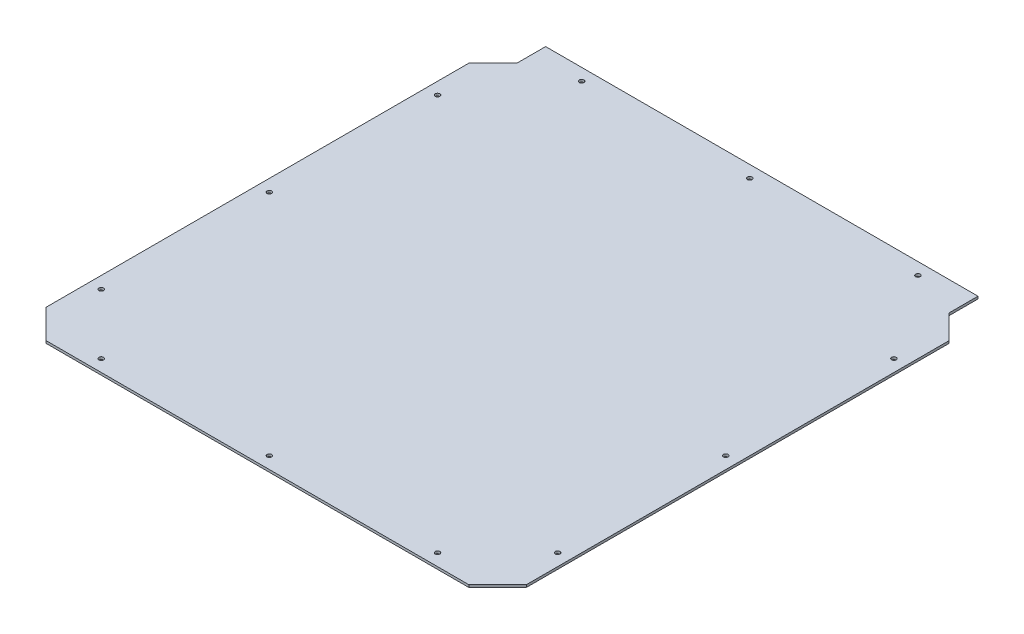
ISO-10303-21;
HEADER;
FILE_DESCRIPTION(('STEP AP214'),'2;1');
FILE_NAME('part.step','',(''),(''),'','','');
FILE_SCHEMA(('AUTOMOTIVE_DESIGN { 1 0 10303 214 1 1 1 1 }'));
ENDSEC;
DATA;
#1=APPLICATION_CONTEXT('core data for automotive mechanical design processes');
#2=APPLICATION_PROTOCOL_DEFINITION('international standard','automotive_design',2000,#1);
#3=PRODUCT_CONTEXT('',#1,'mechanical');
#4=PRODUCT('Part','Part','',(#3));
#5=PRODUCT_RELATED_PRODUCT_CATEGORY('part','',(#4));
#6=PRODUCT_DEFINITION_FORMATION('','',#4);
#7=PRODUCT_DEFINITION_CONTEXT('part definition',#1,'design');
#8=PRODUCT_DEFINITION('design','',#6,#7);
#9=PRODUCT_DEFINITION_SHAPE('','',#8);
#10=(LENGTH_UNIT() NAMED_UNIT(*) SI_UNIT(.MILLI.,.METRE.));
#11=(NAMED_UNIT(*) PLANE_ANGLE_UNIT() SI_UNIT($,.RADIAN.));
#12=(NAMED_UNIT(*) SI_UNIT($,.STERADIAN.) SOLID_ANGLE_UNIT());
#13=UNCERTAINTY_MEASURE_WITH_UNIT(LENGTH_MEASURE(1.E-05),#10,'distance_accuracy_value','');
#14=(GEOMETRIC_REPRESENTATION_CONTEXT(3) GLOBAL_UNCERTAINTY_ASSIGNED_CONTEXT((#13)) GLOBAL_UNIT_ASSIGNED_CONTEXT((#10,
#11,#12)) REPRESENTATION_CONTEXT('',''));
#15=CARTESIAN_POINT('',(0.,0.,0.));
#16=DIRECTION('',(0.,0.,1.));
#17=DIRECTION('',(1.,0.,0.));
#18=AXIS2_PLACEMENT_3D('',#15,#16,#17);
#19=CARTESIAN_POINT('',(-300.,1.5,315.));
#20=DIRECTION('',(1.,0.,0.));
#21=DIRECTION('',(0.,0.,-1.));
#22=AXIS2_PLACEMENT_3D('',#19,#20,#21);
#23=PLANE('',#22);
#24=DIRECTION('',(0.,0.,1.));
#25=VECTOR('',#24,1.);
#26=CARTESIAN_POINT('',(-300.,-1.5,315.));
#27=LINE('',#26,#25);
#28=CARTESIAN_POINT('',(-300.,-1.5,-249.));
#29=VERTEX_POINT('',#28);
#30=CARTESIAN_POINT('',(-300.,-1.5,279.));
#31=VERTEX_POINT('',#30);
#32=EDGE_CURVE('E142',#29,#31,#27,.T.);
#33=ORIENTED_EDGE('',*,*,#32,.T.);
#34=DIRECTION('',(0.,1.,0.));
#35=VECTOR('',#34,1.);
#36=CARTESIAN_POINT('',(-300.,-1.5,279.));
#37=LINE('',#36,#35);
#38=CARTESIAN_POINT('',(-300.,1.5,279.));
#39=VERTEX_POINT('',#38);
#40=EDGE_CURVE('E179',#31,#39,#37,.T.);
#41=ORIENTED_EDGE('',*,*,#40,.T.);
#42=DIRECTION('',(0.,0.,1.));
#43=VECTOR('',#42,1.);
#44=CARTESIAN_POINT('',(-300.,1.5,315.));
#45=LINE('',#44,#43);
#46=CARTESIAN_POINT('',(-300.,1.5,-249.));
#47=VERTEX_POINT('',#46);
#48=EDGE_CURVE('E131',#47,#39,#45,.T.);
#49=ORIENTED_EDGE('',*,*,#48,.F.);
#50=DIRECTION('',(0.,1.,0.));
#51=VECTOR('',#50,1.);
#52=CARTESIAN_POINT('',(-300.,-1.5,-249.));
#53=LINE('',#52,#51);
#54=EDGE_CURVE('E116',#29,#47,#53,.T.);
#55=ORIENTED_EDGE('',*,*,#54,.F.);
#56=EDGE_LOOP('',(#33,#41,#49,#55));
#57=FACE_BOUND('',#56,.T.);
#58=ADVANCED_FACE('F33',(#57),#23,.F.);
#59=CARTESIAN_POINT('',(300.,1.5,315.));
#60=DIRECTION('',(0.,0.,-1.));
#61=DIRECTION('',(-1.,0.,0.));
#62=AXIS2_PLACEMENT_3D('',#59,#60,#61);
#63=PLANE('',#62);
#64=DIRECTION('',(1.,0.,0.));
#65=VECTOR('',#64,1.);
#66=CARTESIAN_POINT('',(300.,-1.5,315.));
#67=LINE('',#66,#65);
#68=CARTESIAN_POINT('',(-264.,-1.5,315.));
#69=VERTEX_POINT('',#68);
#70=CARTESIAN_POINT('',(264.,-1.5,315.));
#71=VERTEX_POINT('',#70);
#72=EDGE_CURVE('E137',#69,#71,#67,.T.);
#73=ORIENTED_EDGE('',*,*,#72,.T.);
#74=DIRECTION('',(0.,1.,0.));
#75=VECTOR('',#74,1.);
#76=CARTESIAN_POINT('',(264.,-1.5,315.));
#77=LINE('',#76,#75);
#78=CARTESIAN_POINT('',(264.,1.5,315.));
#79=VERTEX_POINT('',#78);
#80=EDGE_CURVE('E165',#71,#79,#77,.T.);
#81=ORIENTED_EDGE('',*,*,#80,.T.);
#82=DIRECTION('',(1.,0.,0.));
#83=VECTOR('',#82,1.);
#84=CARTESIAN_POINT('',(300.,1.5,315.));
#85=LINE('',#84,#83);
#86=CARTESIAN_POINT('',(-264.,1.5,315.));
#87=VERTEX_POINT('',#86);
#88=EDGE_CURVE('E134',#87,#79,#85,.T.);
#89=ORIENTED_EDGE('',*,*,#88,.F.);
#90=DIRECTION('',(0.,1.,0.));
#91=VECTOR('',#90,1.);
#92=CARTESIAN_POINT('',(-264.,-1.5,315.));
#93=LINE('',#92,#91);
#94=EDGE_CURVE('E177',#69,#87,#93,.T.);
#95=ORIENTED_EDGE('',*,*,#94,.F.);
#96=EDGE_LOOP('',(#73,#81,#89,#95));
#97=FACE_BOUND('',#96,.T.);
#98=ADVANCED_FACE('F313',(#97),#63,.F.);
#99=CARTESIAN_POINT('',(300.,1.5,315.));
#100=DIRECTION('',(-1.,0.,0.));
#101=DIRECTION('',(0.,0.,1.));
#102=AXIS2_PLACEMENT_3D('',#99,#100,#101);
#103=PLANE('',#102);
#104=DIRECTION('',(0.,0.,-1.));
#105=VECTOR('',#104,1.);
#106=CARTESIAN_POINT('',(300.,1.5,315.));
#107=LINE('',#106,#105);
#108=CARTESIAN_POINT('',(300.,1.5,279.));
#109=VERTEX_POINT('',#108);
#110=CARTESIAN_POINT('',(300.,1.5,-249.));
#111=VERTEX_POINT('',#110);
#112=EDGE_CURVE('E41',#109,#111,#107,.T.);
#113=ORIENTED_EDGE('',*,*,#112,.F.);
#114=DIRECTION('',(0.,1.,0.));
#115=VECTOR('',#114,1.);
#116=CARTESIAN_POINT('',(300.,-1.5,279.));
#117=LINE('',#116,#115);
#118=CARTESIAN_POINT('',(300.,-1.5,279.));
#119=VERTEX_POINT('',#118);
#120=EDGE_CURVE('E168',#119,#109,#117,.T.);
#121=ORIENTED_EDGE('',*,*,#120,.F.);
#122=DIRECTION('',(0.,0.,-1.));
#123=VECTOR('',#122,1.);
#124=CARTESIAN_POINT('',(300.,-1.5,315.));
#125=LINE('',#124,#123);
#126=CARTESIAN_POINT('',(300.,-1.5,-249.));
#127=VERTEX_POINT('',#126);
#128=EDGE_CURVE('E132',#119,#127,#125,.T.);
#129=ORIENTED_EDGE('',*,*,#128,.T.);
#130=DIRECTION('',(0.,1.,0.));
#131=VECTOR('',#130,1.);
#132=CARTESIAN_POINT('',(300.,-1.5,-249.));
#133=LINE('',#132,#131);
#134=EDGE_CURVE('E146',#127,#111,#133,.T.);
#135=ORIENTED_EDGE('',*,*,#134,.T.);
#136=EDGE_LOOP('',(#113,#121,#129,#135));
#137=FACE_BOUND('',#136,.T.);
#138=ADVANCED_FACE('F298',(#137),#103,.F.);
#139=CARTESIAN_POINT('',(300.,1.5,-315.));
#140=DIRECTION('',(0.,0.,1.));
#141=DIRECTION('',(1.,0.,0.));
#142=AXIS2_PLACEMENT_3D('',#139,#140,#141);
#143=PLANE('',#142);
#144=DIRECTION('',(-1.,0.,0.));
#145=VECTOR('',#144,1.);
#146=CARTESIAN_POINT('',(300.,-1.5,-315.));
#147=LINE('',#146,#145);
#148=CARTESIAN_POINT('',(270.,-1.5,-315.));
#149=VERTEX_POINT('',#148);
#150=CARTESIAN_POINT('',(-270.,-1.5,-315.));
#151=VERTEX_POINT('',#150);
#152=EDGE_CURVE('E36',#149,#151,#147,.T.);
#153=ORIENTED_EDGE('',*,*,#152,.T.);
#154=DIRECTION('',(0.,1.,0.));
#155=VECTOR('',#154,1.);
#156=CARTESIAN_POINT('',(-270.,-1.5,-315.));
#157=LINE('',#156,#155);
#158=CARTESIAN_POINT('',(-270.,1.5,-315.));
#159=VERTEX_POINT('',#158);
#160=EDGE_CURVE('E109',#151,#159,#157,.T.);
#161=ORIENTED_EDGE('',*,*,#160,.T.);
#162=DIRECTION('',(-1.,0.,0.));
#163=VECTOR('',#162,1.);
#164=CARTESIAN_POINT('',(300.,1.5,-315.));
#165=LINE('',#164,#163);
#166=CARTESIAN_POINT('',(270.,1.5,-315.));
#167=VERTEX_POINT('',#166);
#168=EDGE_CURVE('E11',#167,#159,#165,.T.);
#169=ORIENTED_EDGE('',*,*,#168,.F.);
#170=DIRECTION('',(0.,1.,0.));
#171=VECTOR('',#170,1.);
#172=CARTESIAN_POINT('',(270.,-1.5,-315.));
#173=LINE('',#172,#171);
#174=EDGE_CURVE('E130',#149,#167,#173,.T.);
#175=ORIENTED_EDGE('',*,*,#174,.F.);
#176=EDGE_LOOP('',(#153,#161,#169,#175));
#177=FACE_BOUND('',#176,.T.);
#178=ADVANCED_FACE('F129',(#177),#143,.F.);
#179=CARTESIAN_POINT('',(0.,1.5,0.));
#180=DIRECTION('',(0.,1.,0.));
#181=DIRECTION('',(0.,0.,1.));
#182=AXIS2_PLACEMENT_3D('',#179,#180,#181);
#183=PLANE('',#182);
#184=CARTESIAN_POINT('',(-210.,1.5,-300.));
#185=DIRECTION('',(0.,1.,0.));
#186=DIRECTION('',(0.,0.,1.));
#187=AXIS2_PLACEMENT_3D('',#184,#185,#186);
#188=CIRCLE('',#187,2.89999999999999);
#189=CARTESIAN_POINT('',(-210.,1.5,-297.1));
#190=VERTEX_POINT('',#189);
#191=EDGE_CURVE('E260',#190,#190,#188,.T.);
#192=ORIENTED_EDGE('',*,*,#191,.F.);
#193=EDGE_LOOP('',(#192));
#194=FACE_BOUND('',#193,.T.);
#195=CARTESIAN_POINT('',(0.,1.5,-300.));
#196=DIRECTION('',(0.,1.,0.));
#197=DIRECTION('',(0.,0.,1.));
#198=AXIS2_PLACEMENT_3D('',#195,#196,#197);
#199=CIRCLE('',#198,2.89999999999999);
#200=CARTESIAN_POINT('',(0.,1.5,-297.1));
#201=VERTEX_POINT('',#200);
#202=EDGE_CURVE('E254',#201,#201,#199,.T.);
#203=ORIENTED_EDGE('',*,*,#202,.F.);
#204=EDGE_LOOP('',(#203));
#205=FACE_BOUND('',#204,.T.);
#206=CARTESIAN_POINT('',(210.,1.5,-300.));
#207=DIRECTION('',(0.,1.,0.));
#208=DIRECTION('',(0.,0.,1.));
#209=AXIS2_PLACEMENT_3D('',#206,#207,#208);
#210=CIRCLE('',#209,2.89999999999999);
#211=CARTESIAN_POINT('',(210.,1.5,-297.1));
#212=VERTEX_POINT('',#211);
#213=EDGE_CURVE('E248',#212,#212,#210,.T.);
#214=ORIENTED_EDGE('',*,*,#213,.F.);
#215=EDGE_LOOP('',(#214));
#216=FACE_BOUND('',#215,.T.);
#217=CARTESIAN_POINT('',(285.,1.5,-195.));
#218=DIRECTION('',(0.,1.,0.));
#219=DIRECTION('',(0.,0.,1.));
#220=AXIS2_PLACEMENT_3D('',#217,#218,#219);
#221=CIRCLE('',#220,2.90000000000001);
#222=CARTESIAN_POINT('',(285.,1.5,-192.1));
#223=VERTEX_POINT('',#222);
#224=EDGE_CURVE('E242',#223,#223,#221,.T.);
#225=ORIENTED_EDGE('',*,*,#224,.F.);
#226=EDGE_LOOP('',(#225));
#227=FACE_BOUND('',#226,.T.);
#228=CARTESIAN_POINT('',(285.,1.5,15.));
#229=DIRECTION('',(0.,1.,0.));
#230=DIRECTION('',(0.,0.,1.));
#231=AXIS2_PLACEMENT_3D('',#228,#229,#230);
#232=CIRCLE('',#231,2.90000000000001);
#233=CARTESIAN_POINT('',(285.,1.5,17.9));
#234=VERTEX_POINT('',#233);
#235=EDGE_CURVE('E236',#234,#234,#232,.T.);
#236=ORIENTED_EDGE('',*,*,#235,.F.);
#237=EDGE_LOOP('',(#236));
#238=FACE_BOUND('',#237,.T.);
#239=CARTESIAN_POINT('',(285.,1.5,225.));
#240=DIRECTION('',(0.,1.,0.));
#241=DIRECTION('',(0.,0.,1.));
#242=AXIS2_PLACEMENT_3D('',#239,#240,#241);
#243=CIRCLE('',#242,2.90000000000001);
#244=CARTESIAN_POINT('',(285.,1.5,227.9));
#245=VERTEX_POINT('',#244);
#246=EDGE_CURVE('E230',#245,#245,#243,.T.);
#247=ORIENTED_EDGE('',*,*,#246,.F.);
#248=EDGE_LOOP('',(#247));
#249=FACE_BOUND('',#248,.T.);
#250=CARTESIAN_POINT('',(210.,1.5,300.));
#251=DIRECTION('',(0.,1.,0.));
#252=DIRECTION('',(0.,0.,1.));
#253=AXIS2_PLACEMENT_3D('',#250,#251,#252);
#254=CIRCLE('',#253,2.89999999999999);
#255=CARTESIAN_POINT('',(210.,1.5,302.9));
#256=VERTEX_POINT('',#255);
#257=EDGE_CURVE('E224',#256,#256,#254,.T.);
#258=ORIENTED_EDGE('',*,*,#257,.F.);
#259=EDGE_LOOP('',(#258));
#260=FACE_BOUND('',#259,.T.);
#261=CARTESIAN_POINT('',(0.,1.5,300.));
#262=DIRECTION('',(0.,1.,0.));
#263=DIRECTION('',(0.,0.,1.));
#264=AXIS2_PLACEMENT_3D('',#261,#262,#263);
#265=CIRCLE('',#264,2.89999999999999);
#266=CARTESIAN_POINT('',(0.,1.5,302.9));
#267=VERTEX_POINT('',#266);
#268=EDGE_CURVE('E218',#267,#267,#265,.T.);
#269=ORIENTED_EDGE('',*,*,#268,.F.);
#270=EDGE_LOOP('',(#269));
#271=FACE_BOUND('',#270,.T.);
#272=CARTESIAN_POINT('',(-210.,1.5,300.));
#273=DIRECTION('',(0.,1.,0.));
#274=DIRECTION('',(0.,0.,1.));
#275=AXIS2_PLACEMENT_3D('',#272,#273,#274);
#276=CIRCLE('',#275,2.89999999999999);
#277=CARTESIAN_POINT('',(-210.,1.5,302.9));
#278=VERTEX_POINT('',#277);
#279=EDGE_CURVE('E212',#278,#278,#276,.T.);
#280=ORIENTED_EDGE('',*,*,#279,.F.);
#281=EDGE_LOOP('',(#280));
#282=FACE_BOUND('',#281,.T.);
#283=CARTESIAN_POINT('',(-285.,1.5,225.));
#284=DIRECTION('',(0.,1.,0.));
#285=DIRECTION('',(0.,0.,1.));
#286=AXIS2_PLACEMENT_3D('',#283,#284,#285);
#287=CIRCLE('',#286,2.90000000000001);
#288=CARTESIAN_POINT('',(-285.,1.5,227.9));
#289=VERTEX_POINT('',#288);
#290=EDGE_CURVE('E206',#289,#289,#287,.T.);
#291=ORIENTED_EDGE('',*,*,#290,.F.);
#292=EDGE_LOOP('',(#291));
#293=FACE_BOUND('',#292,.T.);
#294=CARTESIAN_POINT('',(-285.,1.5,15.0000000000001));
#295=DIRECTION('',(0.,1.,0.));
#296=DIRECTION('',(0.,0.,1.));
#297=AXIS2_PLACEMENT_3D('',#294,#295,#296);
#298=CIRCLE('',#297,2.90000000000001);
#299=CARTESIAN_POINT('',(-285.,1.5,17.9000000000001));
#300=VERTEX_POINT('',#299);
#301=EDGE_CURVE('E200',#300,#300,#298,.T.);
#302=ORIENTED_EDGE('',*,*,#301,.F.);
#303=EDGE_LOOP('',(#302));
#304=FACE_BOUND('',#303,.T.);
#305=CARTESIAN_POINT('',(-285.,1.5,-195.));
#306=DIRECTION('',(0.,1.,0.));
#307=DIRECTION('',(0.,0.,1.));
#308=AXIS2_PLACEMENT_3D('',#305,#306,#307);
#309=CIRCLE('',#308,2.90000000000001);
#310=CARTESIAN_POINT('',(-285.,1.5,-192.1));
#311=VERTEX_POINT('',#310);
#312=EDGE_CURVE('E194',#311,#311,#309,.T.);
#313=ORIENTED_EDGE('',*,*,#312,.F.);
#314=EDGE_LOOP('',(#313));
#315=FACE_BOUND('',#314,.T.);
#316=DIRECTION('',(-0.707106781186546,0.,0.707106781186549));
#317=VECTOR('',#316,1.);
#318=CARTESIAN_POINT('',(300.,1.5,279.));
#319=LINE('',#318,#317);
#320=EDGE_CURVE('E172',#109,#79,#319,.T.);
#321=ORIENTED_EDGE('',*,*,#320,.F.);
#322=ORIENTED_EDGE('',*,*,#112,.T.);
#323=DIRECTION('',(0.70710678118655,0.,0.707106781186545));
#324=VECTOR('',#323,1.);
#325=CARTESIAN_POINT('',(270.,1.5,-279.));
#326=LINE('',#325,#324);
#327=CARTESIAN_POINT('',(270.,1.5,-279.));
#328=VERTEX_POINT('',#327);
#329=EDGE_CURVE('E156',#328,#111,#326,.T.);
#330=ORIENTED_EDGE('',*,*,#329,.F.);
#331=DIRECTION('',(0.,0.,1.));
#332=VECTOR('',#331,1.);
#333=CARTESIAN_POINT('',(270.,1.5,-315.));
#334=LINE('',#333,#332);
#335=EDGE_CURVE('E159',#167,#328,#334,.T.);
#336=ORIENTED_EDGE('',*,*,#335,.F.);
#337=ORIENTED_EDGE('',*,*,#168,.T.);
#338=DIRECTION('',(0.,0.,-1.));
#339=VECTOR('',#338,1.);
#340=CARTESIAN_POINT('',(-270.,1.5,-278.999999999999));
#341=LINE('',#340,#339);
#342=CARTESIAN_POINT('',(-270.,1.5,-278.999999999999));
#343=VERTEX_POINT('',#342);
#344=EDGE_CURVE('E112',#343,#159,#341,.T.);
#345=ORIENTED_EDGE('',*,*,#344,.F.);
#346=DIRECTION('',(0.707106781186554,0.,-0.707106781186541));
#347=VECTOR('',#346,1.);
#348=CARTESIAN_POINT('',(-300.,1.5,-249.));
#349=LINE('',#348,#347);
#350=EDGE_CURVE('E126',#47,#343,#349,.T.);
#351=ORIENTED_EDGE('',*,*,#350,.F.);
#352=ORIENTED_EDGE('',*,*,#48,.T.);
#353=DIRECTION('',(-0.707106781186548,0.,-0.707106781186548));
#354=VECTOR('',#353,1.);
#355=CARTESIAN_POINT('',(-300.,1.5,279.));
#356=LINE('',#355,#354);
#357=EDGE_CURVE('E171',#87,#39,#356,.T.);
#358=ORIENTED_EDGE('',*,*,#357,.F.);
#359=ORIENTED_EDGE('',*,*,#88,.T.);
#360=EDGE_LOOP('',(#321,#322,#330,#336,#337,#345,#351,#352,#358,#359));
#361=FACE_BOUND('',#360,.T.);
#362=ADVANCED_FACE('F266',(#194,#205,#216,#227,#238,#249,#260,#271,#282,#293,#304,#315,#361),
#183,.T.);
#363=CARTESIAN_POINT('',(0.,-1.5,0.));
#364=DIRECTION('',(0.,1.,0.));
#365=DIRECTION('',(0.,0.,1.));
#366=AXIS2_PLACEMENT_3D('',#363,#364,#365);
#367=PLANE('',#366);
#368=CARTESIAN_POINT('',(-210.,-1.5,-300.));
#369=DIRECTION('',(0.,1.,0.));
#370=DIRECTION('',(0.,0.,1.));
#371=AXIS2_PLACEMENT_3D('',#368,#369,#370);
#372=CIRCLE('',#371,2.89999999999999);
#373=CARTESIAN_POINT('',(-210.,-1.5,-297.1));
#374=VERTEX_POINT('',#373);
#375=EDGE_CURVE('E257',#374,#374,#372,.T.);
#376=ORIENTED_EDGE('',*,*,#375,.T.);
#377=EDGE_LOOP('',(#376));
#378=FACE_BOUND('',#377,.T.);
#379=CARTESIAN_POINT('',(0.,-1.5,-300.));
#380=DIRECTION('',(0.,1.,0.));
#381=DIRECTION('',(0.,0.,1.));
#382=AXIS2_PLACEMENT_3D('',#379,#380,#381);
#383=CIRCLE('',#382,2.9);
#384=CARTESIAN_POINT('',(0.,-1.5,-297.1));
#385=VERTEX_POINT('',#384);
#386=EDGE_CURVE('E251',#385,#385,#383,.T.);
#387=ORIENTED_EDGE('',*,*,#386,.T.);
#388=EDGE_LOOP('',(#387));
#389=FACE_BOUND('',#388,.T.);
#390=CARTESIAN_POINT('',(210.,-1.5,-300.));
#391=DIRECTION('',(0.,1.,0.));
#392=DIRECTION('',(0.,0.,1.));
#393=AXIS2_PLACEMENT_3D('',#390,#391,#392);
#394=CIRCLE('',#393,2.89999999999999);
#395=CARTESIAN_POINT('',(210.,-1.5,-297.1));
#396=VERTEX_POINT('',#395);
#397=EDGE_CURVE('E245',#396,#396,#394,.T.);
#398=ORIENTED_EDGE('',*,*,#397,.T.);
#399=EDGE_LOOP('',(#398));
#400=FACE_BOUND('',#399,.T.);
#401=CARTESIAN_POINT('',(285.,-1.5,-195.));
#402=DIRECTION('',(0.,1.,0.));
#403=DIRECTION('',(0.,0.,1.));
#404=AXIS2_PLACEMENT_3D('',#401,#402,#403);
#405=CIRCLE('',#404,2.90000000000001);
#406=CARTESIAN_POINT('',(285.,-1.5,-192.1));
#407=VERTEX_POINT('',#406);
#408=EDGE_CURVE('E239',#407,#407,#405,.T.);
#409=ORIENTED_EDGE('',*,*,#408,.T.);
#410=EDGE_LOOP('',(#409));
#411=FACE_BOUND('',#410,.T.);
#412=CARTESIAN_POINT('',(285.,-1.5,15.));
#413=DIRECTION('',(0.,1.,0.));
#414=DIRECTION('',(0.,0.,1.));
#415=AXIS2_PLACEMENT_3D('',#412,#413,#414);
#416=CIRCLE('',#415,2.90000000000001);
#417=CARTESIAN_POINT('',(285.,-1.5,17.9));
#418=VERTEX_POINT('',#417);
#419=EDGE_CURVE('E233',#418,#418,#416,.T.);
#420=ORIENTED_EDGE('',*,*,#419,.T.);
#421=EDGE_LOOP('',(#420));
#422=FACE_BOUND('',#421,.T.);
#423=CARTESIAN_POINT('',(285.,-1.5,225.));
#424=DIRECTION('',(0.,1.,0.));
#425=DIRECTION('',(0.,0.,1.));
#426=AXIS2_PLACEMENT_3D('',#423,#424,#425);
#427=CIRCLE('',#426,2.90000000000001);
#428=CARTESIAN_POINT('',(285.,-1.5,227.9));
#429=VERTEX_POINT('',#428);
#430=EDGE_CURVE('E227',#429,#429,#427,.T.);
#431=ORIENTED_EDGE('',*,*,#430,.T.);
#432=EDGE_LOOP('',(#431));
#433=FACE_BOUND('',#432,.T.);
#434=CARTESIAN_POINT('',(210.,-1.5,300.));
#435=DIRECTION('',(0.,1.,0.));
#436=DIRECTION('',(0.,0.,1.));
#437=AXIS2_PLACEMENT_3D('',#434,#435,#436);
#438=CIRCLE('',#437,2.89999999999999);
#439=CARTESIAN_POINT('',(210.,-1.5,302.9));
#440=VERTEX_POINT('',#439);
#441=EDGE_CURVE('E221',#440,#440,#438,.T.);
#442=ORIENTED_EDGE('',*,*,#441,.T.);
#443=EDGE_LOOP('',(#442));
#444=FACE_BOUND('',#443,.T.);
#445=CARTESIAN_POINT('',(0.,-1.5,300.));
#446=DIRECTION('',(0.,1.,0.));
#447=DIRECTION('',(0.,0.,1.));
#448=AXIS2_PLACEMENT_3D('',#445,#446,#447);
#449=CIRCLE('',#448,2.9);
#450=CARTESIAN_POINT('',(0.,-1.5,302.9));
#451=VERTEX_POINT('',#450);
#452=EDGE_CURVE('E215',#451,#451,#449,.T.);
#453=ORIENTED_EDGE('',*,*,#452,.T.);
#454=EDGE_LOOP('',(#453));
#455=FACE_BOUND('',#454,.T.);
#456=CARTESIAN_POINT('',(-210.,-1.5,300.));
#457=DIRECTION('',(0.,1.,0.));
#458=DIRECTION('',(0.,0.,1.));
#459=AXIS2_PLACEMENT_3D('',#456,#457,#458);
#460=CIRCLE('',#459,2.89999999999999);
#461=CARTESIAN_POINT('',(-210.,-1.5,302.9));
#462=VERTEX_POINT('',#461);
#463=EDGE_CURVE('E209',#462,#462,#460,.T.);
#464=ORIENTED_EDGE('',*,*,#463,.T.);
#465=EDGE_LOOP('',(#464));
#466=FACE_BOUND('',#465,.T.);
#467=CARTESIAN_POINT('',(-285.,-1.5,225.));
#468=DIRECTION('',(0.,1.,0.));
#469=DIRECTION('',(0.,0.,1.));
#470=AXIS2_PLACEMENT_3D('',#467,#468,#469);
#471=CIRCLE('',#470,2.90000000000001);
#472=CARTESIAN_POINT('',(-285.,-1.5,227.9));
#473=VERTEX_POINT('',#472);
#474=EDGE_CURVE('E203',#473,#473,#471,.T.);
#475=ORIENTED_EDGE('',*,*,#474,.T.);
#476=EDGE_LOOP('',(#475));
#477=FACE_BOUND('',#476,.T.);
#478=CARTESIAN_POINT('',(-285.,-1.5,15.0000000000001));
#479=DIRECTION('',(0.,1.,0.));
#480=DIRECTION('',(0.,0.,1.));
#481=AXIS2_PLACEMENT_3D('',#478,#479,#480);
#482=CIRCLE('',#481,2.90000000000001);
#483=CARTESIAN_POINT('',(-285.,-1.5,17.9000000000001));
#484=VERTEX_POINT('',#483);
#485=EDGE_CURVE('E197',#484,#484,#482,.T.);
#486=ORIENTED_EDGE('',*,*,#485,.T.);
#487=EDGE_LOOP('',(#486));
#488=FACE_BOUND('',#487,.T.);
#489=CARTESIAN_POINT('',(-285.,-1.5,-195.));
#490=DIRECTION('',(0.,1.,0.));
#491=DIRECTION('',(0.,0.,1.));
#492=AXIS2_PLACEMENT_3D('',#489,#490,#491);
#493=CIRCLE('',#492,2.90000000000001);
#494=CARTESIAN_POINT('',(-285.,-1.5,-192.1));
#495=VERTEX_POINT('',#494);
#496=EDGE_CURVE('E174',#495,#495,#493,.T.);
#497=ORIENTED_EDGE('',*,*,#496,.T.);
#498=EDGE_LOOP('',(#497));
#499=FACE_BOUND('',#498,.T.);
#500=ORIENTED_EDGE('',*,*,#128,.F.);
#501=DIRECTION('',(-0.707106781186546,0.,0.707106781186549));
#502=VECTOR('',#501,1.);
#503=CARTESIAN_POINT('',(300.,-1.5,279.));
#504=LINE('',#503,#502);
#505=EDGE_CURVE('E169',#119,#71,#504,.T.);
#506=ORIENTED_EDGE('',*,*,#505,.T.);
#507=ORIENTED_EDGE('',*,*,#72,.F.);
#508=DIRECTION('',(-0.707106781186548,0.,-0.707106781186548));
#509=VECTOR('',#508,1.);
#510=CARTESIAN_POINT('',(-300.,-1.5,279.));
#511=LINE('',#510,#509);
#512=EDGE_CURVE('E180',#69,#31,#511,.T.);
#513=ORIENTED_EDGE('',*,*,#512,.T.);
#514=ORIENTED_EDGE('',*,*,#32,.F.);
#515=DIRECTION('',(0.707106781186554,0.,-0.707106781186541));
#516=VECTOR('',#515,1.);
#517=CARTESIAN_POINT('',(-300.,-1.5,-249.));
#518=LINE('',#517,#516);
#519=CARTESIAN_POINT('',(-270.,-1.5,-278.999999999999));
#520=VERTEX_POINT('',#519);
#521=EDGE_CURVE('E117',#29,#520,#518,.T.);
#522=ORIENTED_EDGE('',*,*,#521,.T.);
#523=DIRECTION('',(0.,0.,-1.));
#524=VECTOR('',#523,1.);
#525=CARTESIAN_POINT('',(-270.,-1.5,-278.999999999999));
#526=LINE('',#525,#524);
#527=EDGE_CURVE('E49',#520,#151,#526,.T.);
#528=ORIENTED_EDGE('',*,*,#527,.T.);
#529=ORIENTED_EDGE('',*,*,#152,.F.);
#530=DIRECTION('',(0.,0.,1.));
#531=VECTOR('',#530,1.);
#532=CARTESIAN_POINT('',(270.,-1.5,-315.));
#533=LINE('',#532,#531);
#534=CARTESIAN_POINT('',(270.,-1.5,-279.));
#535=VERTEX_POINT('',#534);
#536=EDGE_CURVE('E158',#149,#535,#533,.T.);
#537=ORIENTED_EDGE('',*,*,#536,.T.);
#538=DIRECTION('',(0.70710678118655,0.,0.707106781186545));
#539=VECTOR('',#538,1.);
#540=CARTESIAN_POINT('',(270.,-1.5,-279.));
#541=LINE('',#540,#539);
#542=EDGE_CURVE('E57',#535,#127,#541,.T.);
#543=ORIENTED_EDGE('',*,*,#542,.T.);
#544=EDGE_LOOP('',(#500,#506,#507,#513,#514,#522,#528,#529,#537,#543));
#545=FACE_BOUND('',#544,.T.);
#546=ADVANCED_FACE('F123',(#378,#389,#400,#411,#422,#433,#444,#455,#466,#477,#488,#499,#545),
#367,.F.);
#547=CARTESIAN_POINT('',(270.,-1.5,-279.));
#548=DIRECTION('',(-0.707106781186545,0.,0.70710678118655));
#549=DIRECTION('',(0.70710678118655,0.,0.707106781186545));
#550=AXIS2_PLACEMENT_3D('',#547,#548,#549);
#551=PLANE('',#550);
#552=ORIENTED_EDGE('',*,*,#329,.T.);
#553=ORIENTED_EDGE('',*,*,#134,.F.);
#554=ORIENTED_EDGE('',*,*,#542,.F.);
#555=DIRECTION('',(0.,1.,0.));
#556=VECTOR('',#555,1.);
#557=CARTESIAN_POINT('',(270.,-1.5,-279.));
#558=LINE('',#557,#556);
#559=EDGE_CURVE('E153',#535,#328,#558,.T.);
#560=ORIENTED_EDGE('',*,*,#559,.T.);
#561=EDGE_LOOP('',(#552,#553,#554,#560));
#562=FACE_BOUND('',#561,.T.);
#563=ADVANCED_FACE('F299',(#562),#551,.F.);
#564=CARTESIAN_POINT('',(270.,-1.5,-315.));
#565=DIRECTION('',(-1.,0.,0.));
#566=DIRECTION('',(0.,0.,1.));
#567=AXIS2_PLACEMENT_3D('',#564,#565,#566);
#568=PLANE('',#567);
#569=ORIENTED_EDGE('',*,*,#335,.T.);
#570=ORIENTED_EDGE('',*,*,#559,.F.);
#571=ORIENTED_EDGE('',*,*,#536,.F.);
#572=ORIENTED_EDGE('',*,*,#174,.T.);
#573=EDGE_LOOP('',(#569,#570,#571,#572));
#574=FACE_BOUND('',#573,.T.);
#575=ADVANCED_FACE('F301',(#574),#568,.F.);
#576=CARTESIAN_POINT('',(-270.,-1.5,-278.999999999999));
#577=DIRECTION('',(1.,0.,0.));
#578=DIRECTION('',(0.,0.,-1.));
#579=AXIS2_PLACEMENT_3D('',#576,#577,#578);
#580=PLANE('',#579);
#581=ORIENTED_EDGE('',*,*,#344,.T.);
#582=ORIENTED_EDGE('',*,*,#160,.F.);
#583=ORIENTED_EDGE('',*,*,#527,.F.);
#584=DIRECTION('',(0.,1.,0.));
#585=VECTOR('',#584,1.);
#586=CARTESIAN_POINT('',(-270.,-1.5,-278.999999999999));
#587=LINE('',#586,#585);
#588=EDGE_CURVE('E162',#520,#343,#587,.T.);
#589=ORIENTED_EDGE('',*,*,#588,.T.);
#590=EDGE_LOOP('',(#581,#582,#583,#589));
#591=FACE_BOUND('',#590,.T.);
#592=ADVANCED_FACE('F110',(#591),#580,.F.);
#593=CARTESIAN_POINT('',(-300.,-1.5,-249.));
#594=DIRECTION('',(0.707106781186541,0.,0.707106781186554));
#595=DIRECTION('',(0.707106781186554,0.,-0.707106781186541));
#596=AXIS2_PLACEMENT_3D('',#593,#594,#595);
#597=PLANE('',#596);
#598=ORIENTED_EDGE('',*,*,#350,.T.);
#599=ORIENTED_EDGE('',*,*,#588,.F.);
#600=ORIENTED_EDGE('',*,*,#521,.F.);
#601=ORIENTED_EDGE('',*,*,#54,.T.);
#602=EDGE_LOOP('',(#598,#599,#600,#601));
#603=FACE_BOUND('',#602,.T.);
#604=ADVANCED_FACE('F325',(#603),#597,.F.);
#605=CARTESIAN_POINT('',(-300.,-1.5,279.));
#606=DIRECTION('',(0.707106781186547,0.,-0.707106781186547));
#607=DIRECTION('',(-0.707106781186548,0.,-0.707106781186548));
#608=AXIS2_PLACEMENT_3D('',#605,#606,#607);
#609=PLANE('',#608);
#610=ORIENTED_EDGE('',*,*,#357,.T.);
#611=ORIENTED_EDGE('',*,*,#40,.F.);
#612=ORIENTED_EDGE('',*,*,#512,.F.);
#613=ORIENTED_EDGE('',*,*,#94,.T.);
#614=EDGE_LOOP('',(#610,#611,#612,#613));
#615=FACE_BOUND('',#614,.T.);
#616=ADVANCED_FACE('F309',(#615),#609,.F.);
#617=CARTESIAN_POINT('',(300.,-1.5,279.));
#618=DIRECTION('',(-0.707106781186548,0.,-0.707106781186546));
#619=DIRECTION('',(-0.707106781186546,0.,0.707106781186549));
#620=AXIS2_PLACEMENT_3D('',#617,#618,#619);
#621=PLANE('',#620);
#622=ORIENTED_EDGE('',*,*,#320,.T.);
#623=ORIENTED_EDGE('',*,*,#80,.F.);
#624=ORIENTED_EDGE('',*,*,#505,.F.);
#625=ORIENTED_EDGE('',*,*,#120,.T.);
#626=EDGE_LOOP('',(#622,#623,#624,#625));
#627=FACE_BOUND('',#626,.T.);
#628=ADVANCED_FACE('F314',(#627),#621,.F.);
#629=CARTESIAN_POINT('',(-285.,1.5,-195.));
#630=DIRECTION('',(0.,1.,0.));
#631=DIRECTION('',(0.,0.,1.));
#632=AXIS2_PLACEMENT_3D('',#629,#630,#631);
#633=CYLINDRICAL_SURFACE('',#632,2.90000000000001);
#634=ORIENTED_EDGE('',*,*,#496,.F.);
#635=EDGE_LOOP('',(#634));
#636=FACE_BOUND('',#635,.T.);
#637=ORIENTED_EDGE('',*,*,#312,.T.);
#638=EDGE_LOOP('',(#637));
#639=FACE_BOUND('',#638,.T.);
#640=ADVANCED_FACE('F316',(#636,#639),#633,.F.);
#641=CARTESIAN_POINT('',(-285.,1.5,15.0000000000001));
#642=DIRECTION('',(0.,1.,0.));
#643=DIRECTION('',(0.,0.,1.));
#644=AXIS2_PLACEMENT_3D('',#641,#642,#643);
#645=CYLINDRICAL_SURFACE('',#644,2.90000000000001);
#646=ORIENTED_EDGE('',*,*,#485,.F.);
#647=EDGE_LOOP('',(#646));
#648=FACE_BOUND('',#647,.T.);
#649=ORIENTED_EDGE('',*,*,#301,.T.);
#650=EDGE_LOOP('',(#649));
#651=FACE_BOUND('',#650,.T.);
#652=ADVANCED_FACE('F322',(#648,#651),#645,.F.);
#653=CARTESIAN_POINT('',(-285.,1.5,225.));
#654=DIRECTION('',(0.,1.,0.));
#655=DIRECTION('',(0.,0.,1.));
#656=AXIS2_PLACEMENT_3D('',#653,#654,#655);
#657=CYLINDRICAL_SURFACE('',#656,2.90000000000001);
#658=ORIENTED_EDGE('',*,*,#474,.F.);
#659=EDGE_LOOP('',(#658));
#660=FACE_BOUND('',#659,.T.);
#661=ORIENTED_EDGE('',*,*,#290,.T.);
#662=EDGE_LOOP('',(#661));
#663=FACE_BOUND('',#662,.T.);
#664=ADVANCED_FACE('F399',(#660,#663),#657,.F.);
#665=CARTESIAN_POINT('',(-210.,1.5,300.));
#666=DIRECTION('',(0.,1.,0.));
#667=DIRECTION('',(0.,0.,1.));
#668=AXIS2_PLACEMENT_3D('',#665,#666,#667);
#669=CYLINDRICAL_SURFACE('',#668,2.89999999999999);
#670=ORIENTED_EDGE('',*,*,#463,.F.);
#671=EDGE_LOOP('',(#670));
#672=FACE_BOUND('',#671,.T.);
#673=ORIENTED_EDGE('',*,*,#279,.T.);
#674=EDGE_LOOP('',(#673));
#675=FACE_BOUND('',#674,.T.);
#676=ADVANCED_FACE('F409',(#672,#675),#669,.F.);
#677=CARTESIAN_POINT('',(0.,1.5,300.));
#678=DIRECTION('',(0.,1.,0.));
#679=DIRECTION('',(0.,0.,1.));
#680=AXIS2_PLACEMENT_3D('',#677,#678,#679);
#681=CYLINDRICAL_SURFACE('',#680,2.89999999999999);
#682=ORIENTED_EDGE('',*,*,#452,.F.);
#683=EDGE_LOOP('',(#682));
#684=FACE_BOUND('',#683,.T.);
#685=ORIENTED_EDGE('',*,*,#268,.T.);
#686=EDGE_LOOP('',(#685));
#687=FACE_BOUND('',#686,.T.);
#688=ADVANCED_FACE('F419',(#684,#687),#681,.F.);
#689=CARTESIAN_POINT('',(210.,1.5,300.));
#690=DIRECTION('',(0.,1.,0.));
#691=DIRECTION('',(0.,0.,1.));
#692=AXIS2_PLACEMENT_3D('',#689,#690,#691);
#693=CYLINDRICAL_SURFACE('',#692,2.89999999999999);
#694=ORIENTED_EDGE('',*,*,#441,.F.);
#695=EDGE_LOOP('',(#694));
#696=FACE_BOUND('',#695,.T.);
#697=ORIENTED_EDGE('',*,*,#257,.T.);
#698=EDGE_LOOP('',(#697));
#699=FACE_BOUND('',#698,.T.);
#700=ADVANCED_FACE('F429',(#696,#699),#693,.F.);
#701=CARTESIAN_POINT('',(285.,1.5,225.));
#702=DIRECTION('',(0.,1.,0.));
#703=DIRECTION('',(0.,0.,1.));
#704=AXIS2_PLACEMENT_3D('',#701,#702,#703);
#705=CYLINDRICAL_SURFACE('',#704,2.90000000000001);
#706=ORIENTED_EDGE('',*,*,#430,.F.);
#707=EDGE_LOOP('',(#706));
#708=FACE_BOUND('',#707,.T.);
#709=ORIENTED_EDGE('',*,*,#246,.T.);
#710=EDGE_LOOP('',(#709));
#711=FACE_BOUND('',#710,.T.);
#712=ADVANCED_FACE('F439',(#708,#711),#705,.F.);
#713=CARTESIAN_POINT('',(285.,1.5,15.));
#714=DIRECTION('',(0.,1.,0.));
#715=DIRECTION('',(0.,0.,1.));
#716=AXIS2_PLACEMENT_3D('',#713,#714,#715);
#717=CYLINDRICAL_SURFACE('',#716,2.90000000000001);
#718=ORIENTED_EDGE('',*,*,#419,.F.);
#719=EDGE_LOOP('',(#718));
#720=FACE_BOUND('',#719,.T.);
#721=ORIENTED_EDGE('',*,*,#235,.T.);
#722=EDGE_LOOP('',(#721));
#723=FACE_BOUND('',#722,.T.);
#724=ADVANCED_FACE('F449',(#720,#723),#717,.F.);
#725=CARTESIAN_POINT('',(285.,1.5,-195.));
#726=DIRECTION('',(0.,1.,0.));
#727=DIRECTION('',(0.,0.,1.));
#728=AXIS2_PLACEMENT_3D('',#725,#726,#727);
#729=CYLINDRICAL_SURFACE('',#728,2.90000000000001);
#730=ORIENTED_EDGE('',*,*,#408,.F.);
#731=EDGE_LOOP('',(#730));
#732=FACE_BOUND('',#731,.T.);
#733=ORIENTED_EDGE('',*,*,#224,.T.);
#734=EDGE_LOOP('',(#733));
#735=FACE_BOUND('',#734,.T.);
#736=ADVANCED_FACE('F459',(#732,#735),#729,.F.);
#737=CARTESIAN_POINT('',(210.,1.5,-300.));
#738=DIRECTION('',(0.,1.,0.));
#739=DIRECTION('',(0.,0.,1.));
#740=AXIS2_PLACEMENT_3D('',#737,#738,#739);
#741=CYLINDRICAL_SURFACE('',#740,2.89999999999999);
#742=ORIENTED_EDGE('',*,*,#397,.F.);
#743=EDGE_LOOP('',(#742));
#744=FACE_BOUND('',#743,.T.);
#745=ORIENTED_EDGE('',*,*,#213,.T.);
#746=EDGE_LOOP('',(#745));
#747=FACE_BOUND('',#746,.T.);
#748=ADVANCED_FACE('F469',(#744,#747),#741,.F.);
#749=CARTESIAN_POINT('',(0.,1.5,-300.));
#750=DIRECTION('',(0.,1.,0.));
#751=DIRECTION('',(0.,0.,1.));
#752=AXIS2_PLACEMENT_3D('',#749,#750,#751);
#753=CYLINDRICAL_SURFACE('',#752,2.89999999999999);
#754=ORIENTED_EDGE('',*,*,#386,.F.);
#755=EDGE_LOOP('',(#754));
#756=FACE_BOUND('',#755,.T.);
#757=ORIENTED_EDGE('',*,*,#202,.T.);
#758=EDGE_LOOP('',(#757));
#759=FACE_BOUND('',#758,.T.);
#760=ADVANCED_FACE('F479',(#756,#759),#753,.F.);
#761=CARTESIAN_POINT('',(-210.,1.5,-300.));
#762=DIRECTION('',(0.,1.,0.));
#763=DIRECTION('',(0.,0.,1.));
#764=AXIS2_PLACEMENT_3D('',#761,#762,#763);
#765=CYLINDRICAL_SURFACE('',#764,2.89999999999999);
#766=ORIENTED_EDGE('',*,*,#375,.F.);
#767=EDGE_LOOP('',(#766));
#768=FACE_BOUND('',#767,.T.);
#769=ORIENTED_EDGE('',*,*,#191,.T.);
#770=EDGE_LOOP('',(#769));
#771=FACE_BOUND('',#770,.T.);
#772=ADVANCED_FACE('F264',(#768,#771),#765,.F.);
#773=CLOSED_SHELL('',(#58,#98,#138,#178,#362,#546,#563,#575,#592,#604,#616,#628,#640,#652,#664,
#676,#688,#700,#712,#724,#736,#748,#760,#772));
#774=MANIFOLD_SOLID_BREP('B2',#773);
#775=ADVANCED_BREP_SHAPE_REPRESENTATION('',(#18,#774),#14);
#776=SHAPE_DEFINITION_REPRESENTATION(#9,#775);
ENDSEC;
END-ISO-10303-21;
